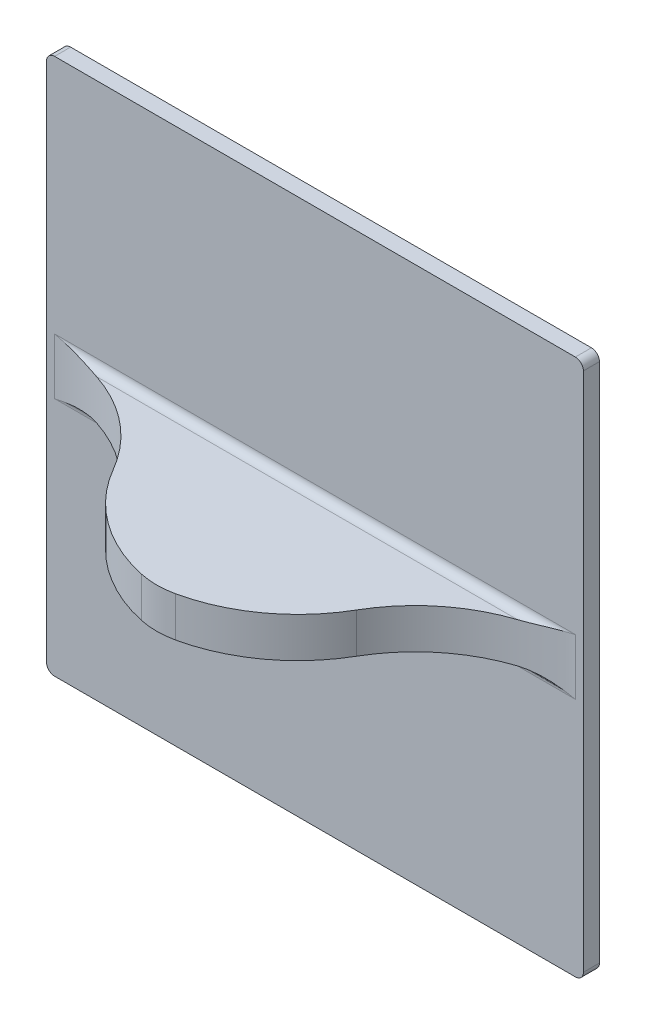
ISO-10303-21;
HEADER;
FILE_DESCRIPTION(('STEP AP214'),'2;1');
FILE_NAME('part.step','',(''),(''),'','','');
FILE_SCHEMA(('AUTOMOTIVE_DESIGN { 1 0 10303 214 1 1 1 1 }'));
ENDSEC;
DATA;
#1=APPLICATION_CONTEXT('core data for automotive mechanical design processes');
#2=APPLICATION_PROTOCOL_DEFINITION('international standard','automotive_design',2000,#1);
#3=PRODUCT_CONTEXT('',#1,'mechanical');
#4=PRODUCT('Part','Part','',(#3));
#5=PRODUCT_RELATED_PRODUCT_CATEGORY('part','',(#4));
#6=PRODUCT_DEFINITION_FORMATION('','',#4);
#7=PRODUCT_DEFINITION_CONTEXT('part definition',#1,'design');
#8=PRODUCT_DEFINITION('design','',#6,#7);
#9=PRODUCT_DEFINITION_SHAPE('','',#8);
#10=(LENGTH_UNIT() NAMED_UNIT(*) SI_UNIT(.MILLI.,.METRE.));
#11=(NAMED_UNIT(*) PLANE_ANGLE_UNIT() SI_UNIT($,.RADIAN.));
#12=(NAMED_UNIT(*) SI_UNIT($,.STERADIAN.) SOLID_ANGLE_UNIT());
#13=UNCERTAINTY_MEASURE_WITH_UNIT(LENGTH_MEASURE(1.E-05),#10,'distance_accuracy_value','');
#14=(GEOMETRIC_REPRESENTATION_CONTEXT(3) GLOBAL_UNCERTAINTY_ASSIGNED_CONTEXT((#13)) GLOBAL_UNIT_ASSIGNED_CONTEXT((#10,
#11,#12)) REPRESENTATION_CONTEXT('',''));
#15=CARTESIAN_POINT('',(0.,0.,0.));
#16=DIRECTION('',(0.,0.,1.));
#17=DIRECTION('',(1.,0.,0.));
#18=AXIS2_PLACEMENT_3D('',#15,#16,#17);
#19=CARTESIAN_POINT('',(-32.5,-32.5,2.));
#20=DIRECTION('',(0.,0.,1.));
#21=DIRECTION('',(1.,0.,0.));
#22=AXIS2_PLACEMENT_3D('',#19,#20,#21);
#23=PLANE('',#22);
#24=CARTESIAN_POINT('',(-32.5,-32.5,2.));
#25=DIRECTION('',(0.,0.,1.));
#26=DIRECTION('',(1.,0.,0.));
#27=AXIS2_PLACEMENT_3D('',#24,#25,#26);
#28=CIRCLE('',#27,1.);
#29=CARTESIAN_POINT('',(-33.5,-32.5,2.));
#30=VERTEX_POINT('',#29);
#31=CARTESIAN_POINT('',(-32.5,-33.5,2.));
#32=VERTEX_POINT('',#31);
#33=EDGE_CURVE('E156',#30,#32,#28,.T.);
#34=ORIENTED_EDGE('',*,*,#33,.T.);
#35=DIRECTION('',(1.,0.,0.));
#36=VECTOR('',#35,1.);
#37=CARTESIAN_POINT('',(-32.5,-33.5,2.));
#38=LINE('',#37,#36);
#39=CARTESIAN_POINT('',(32.5,-33.5,2.));
#40=VERTEX_POINT('',#39);
#41=EDGE_CURVE('E145',#32,#40,#38,.T.);
#42=ORIENTED_EDGE('',*,*,#41,.T.);
#43=CARTESIAN_POINT('',(32.5,-32.5,2.));
#44=DIRECTION('',(0.,0.,1.));
#45=DIRECTION('',(1.,0.,0.));
#46=AXIS2_PLACEMENT_3D('',#43,#44,#45);
#47=CIRCLE('',#46,1.);
#48=CARTESIAN_POINT('',(33.5,-32.5,2.));
#49=VERTEX_POINT('',#48);
#50=EDGE_CURVE('E155',#40,#49,#47,.T.);
#51=ORIENTED_EDGE('',*,*,#50,.T.);
#52=DIRECTION('',(0.,1.,0.));
#53=VECTOR('',#52,1.);
#54=CARTESIAN_POINT('',(33.5,-32.5,2.));
#55=LINE('',#54,#53);
#56=CARTESIAN_POINT('',(33.5,32.5,2.));
#57=VERTEX_POINT('',#56);
#58=EDGE_CURVE('E457',#49,#57,#55,.T.);
#59=ORIENTED_EDGE('',*,*,#58,.T.);
#60=CARTESIAN_POINT('',(32.5,32.5,2.));
#61=DIRECTION('',(0.,0.,1.));
#62=DIRECTION('',(1.,0.,0.));
#63=AXIS2_PLACEMENT_3D('',#60,#61,#62);
#64=CIRCLE('',#63,1.);
#65=CARTESIAN_POINT('',(32.5,33.5,2.));
#66=VERTEX_POINT('',#65);
#67=EDGE_CURVE('E484',#57,#66,#64,.T.);
#68=ORIENTED_EDGE('',*,*,#67,.T.);
#69=DIRECTION('',(-1.,0.,0.));
#70=VECTOR('',#69,1.);
#71=CARTESIAN_POINT('',(-32.5,33.5,2.));
#72=LINE('',#71,#70);
#73=CARTESIAN_POINT('',(-32.5,33.5,2.));
#74=VERTEX_POINT('',#73);
#75=EDGE_CURVE('E486',#66,#74,#72,.T.);
#76=ORIENTED_EDGE('',*,*,#75,.T.);
#77=CARTESIAN_POINT('',(-32.5,32.5,2.));
#78=DIRECTION('',(0.,0.,1.));
#79=DIRECTION('',(-1.,0.,0.));
#80=AXIS2_PLACEMENT_3D('',#77,#78,#79);
#81=CIRCLE('',#80,1.);
#82=CARTESIAN_POINT('',(-33.5,32.5,2.));
#83=VERTEX_POINT('',#82);
#84=EDGE_CURVE('E488',#74,#83,#81,.T.);
#85=ORIENTED_EDGE('',*,*,#84,.T.);
#86=DIRECTION('',(0.,-1.,0.));
#87=VECTOR('',#86,1.);
#88=CARTESIAN_POINT('',(-33.5,-32.5,2.));
#89=LINE('',#88,#87);
#90=EDGE_CURVE('E161',#83,#30,#89,.T.);
#91=ORIENTED_EDGE('',*,*,#90,.T.);
#92=EDGE_LOOP('',(#34,#42,#51,#59,#68,#76,#85,#91));
#93=FACE_BOUND('',#92,.T.);
#94=DIRECTION('',(0.,1.,0.));
#95=VECTOR('',#94,1.);
#96=CARTESIAN_POINT('',(32.5,-32.5,2.));
#97=LINE('',#96,#95);
#98=CARTESIAN_POINT('',(32.5,3.5,2.));
#99=VERTEX_POINT('',#98);
#100=CARTESIAN_POINT('',(32.5,-3.5,2.));
#101=VERTEX_POINT('',#100);
#102=EDGE_CURVE('E170',#99,#101,#97,.F.);
#103=ORIENTED_EDGE('',*,*,#102,.T.);
#104=DIRECTION('',(1.,0.,0.));
#105=VECTOR('',#104,1.);
#106=CARTESIAN_POINT('',(-32.5,-3.5,2.));
#107=LINE('',#106,#105);
#108=CARTESIAN_POINT('',(-32.5,-3.5,2.));
#109=VERTEX_POINT('',#108);
#110=EDGE_CURVE('E195',#101,#109,#107,.F.);
#111=ORIENTED_EDGE('',*,*,#110,.T.);
#112=DIRECTION('',(0.,-1.,0.));
#113=VECTOR('',#112,1.);
#114=CARTESIAN_POINT('',(-32.5,-32.5,2.));
#115=LINE('',#114,#113);
#116=CARTESIAN_POINT('',(-32.5,3.5,2.));
#117=VERTEX_POINT('',#116);
#118=EDGE_CURVE('E172',#109,#117,#115,.F.);
#119=ORIENTED_EDGE('',*,*,#118,.T.);
#120=DIRECTION('',(-1.,0.,0.));
#121=VECTOR('',#120,1.);
#122=CARTESIAN_POINT('',(-32.5,3.5,2.));
#123=LINE('',#122,#121);
#124=EDGE_CURVE('E192',#117,#99,#123,.F.);
#125=ORIENTED_EDGE('',*,*,#124,.T.);
#126=EDGE_LOOP('',(#103,#111,#119,#125));
#127=FACE_BOUND('',#126,.T.);
#128=ADVANCED_FACE('F33',(#93,#127),#23,.T.);
#129=CARTESIAN_POINT('',(-32.5,-32.5,2.));
#130=DIRECTION('',(0.,0.,-1.));
#131=DIRECTION('',(-1.,0.,0.));
#132=AXIS2_PLACEMENT_3D('',#129,#130,#131);
#133=CYLINDRICAL_SURFACE('',#132,1.);
#134=CARTESIAN_POINT('',(-32.5,-32.5,0.));
#135=DIRECTION('',(0.,0.,1.));
#136=DIRECTION('',(1.,0.,0.));
#137=AXIS2_PLACEMENT_3D('',#134,#135,#136);
#138=CIRCLE('',#137,1.);
#139=CARTESIAN_POINT('',(-33.5,-32.5,0.));
#140=VERTEX_POINT('',#139);
#141=CARTESIAN_POINT('',(-32.5,-33.5,0.));
#142=VERTEX_POINT('',#141);
#143=EDGE_CURVE('E169',#140,#142,#138,.T.);
#144=ORIENTED_EDGE('',*,*,#143,.T.);
#145=DIRECTION('',(0.,0.,-1.));
#146=VECTOR('',#145,1.);
#147=CARTESIAN_POINT('',(-32.5,-33.5,2.));
#148=LINE('',#147,#146);
#149=EDGE_CURVE('E149',#32,#142,#148,.T.);
#150=ORIENTED_EDGE('',*,*,#149,.F.);
#151=ORIENTED_EDGE('',*,*,#33,.F.);
#152=DIRECTION('',(0.,0.,-1.));
#153=VECTOR('',#152,1.);
#154=CARTESIAN_POINT('',(-33.5,-32.5,2.));
#155=LINE('',#154,#153);
#156=EDGE_CURVE('E471',#30,#140,#155,.T.);
#157=ORIENTED_EDGE('',*,*,#156,.T.);
#158=EDGE_LOOP('',(#144,#150,#151,#157));
#159=FACE_BOUND('',#158,.T.);
#160=ADVANCED_FACE('F167',(#159),#133,.T.);
#161=CARTESIAN_POINT('',(-32.5,-33.5,2.));
#162=DIRECTION('',(0.,1.,0.));
#163=DIRECTION('',(0.,0.,1.));
#164=AXIS2_PLACEMENT_3D('',#161,#162,#163);
#165=PLANE('',#164);
#166=DIRECTION('',(1.,0.,0.));
#167=VECTOR('',#166,1.);
#168=CARTESIAN_POINT('',(-32.5,-33.5,0.));
#169=LINE('',#168,#167);
#170=CARTESIAN_POINT('',(32.5,-33.5,0.));
#171=VERTEX_POINT('',#170);
#172=EDGE_CURVE('E453',#142,#171,#169,.T.);
#173=ORIENTED_EDGE('',*,*,#172,.T.);
#174=DIRECTION('',(0.,0.,-1.));
#175=VECTOR('',#174,1.);
#176=CARTESIAN_POINT('',(32.5,-33.5,2.));
#177=LINE('',#176,#175);
#178=EDGE_CURVE('E152',#40,#171,#177,.T.);
#179=ORIENTED_EDGE('',*,*,#178,.F.);
#180=ORIENTED_EDGE('',*,*,#41,.F.);
#181=ORIENTED_EDGE('',*,*,#149,.T.);
#182=EDGE_LOOP('',(#173,#179,#180,#181));
#183=FACE_BOUND('',#182,.T.);
#184=ADVANCED_FACE('F147',(#183),#165,.F.);
#185=CARTESIAN_POINT('',(32.5,-32.5,2.));
#186=DIRECTION('',(0.,0.,-1.));
#187=DIRECTION('',(-1.,0.,0.));
#188=AXIS2_PLACEMENT_3D('',#185,#186,#187);
#189=CYLINDRICAL_SURFACE('',#188,1.);
#190=CARTESIAN_POINT('',(32.5,-32.5,0.));
#191=DIRECTION('',(0.,0.,1.));
#192=DIRECTION('',(1.,0.,0.));
#193=AXIS2_PLACEMENT_3D('',#190,#191,#192);
#194=CIRCLE('',#193,1.);
#195=CARTESIAN_POINT('',(33.5,-32.5,0.));
#196=VERTEX_POINT('',#195);
#197=EDGE_CURVE('E448',#171,#196,#194,.T.);
#198=ORIENTED_EDGE('',*,*,#197,.T.);
#199=DIRECTION('',(0.,0.,-1.));
#200=VECTOR('',#199,1.);
#201=CARTESIAN_POINT('',(33.5,-32.5,2.));
#202=LINE('',#201,#200);
#203=EDGE_CURVE('E174',#49,#196,#202,.T.);
#204=ORIENTED_EDGE('',*,*,#203,.F.);
#205=ORIENTED_EDGE('',*,*,#50,.F.);
#206=ORIENTED_EDGE('',*,*,#178,.T.);
#207=EDGE_LOOP('',(#198,#204,#205,#206));
#208=FACE_BOUND('',#207,.T.);
#209=ADVANCED_FACE('F318',(#208),#189,.T.);
#210=CARTESIAN_POINT('',(33.5,-32.5,2.));
#211=DIRECTION('',(-1.,0.,0.));
#212=DIRECTION('',(0.,0.,1.));
#213=AXIS2_PLACEMENT_3D('',#210,#211,#212);
#214=PLANE('',#213);
#215=DIRECTION('',(0.,1.,0.));
#216=VECTOR('',#215,1.);
#217=CARTESIAN_POINT('',(33.5,-32.5,0.));
#218=LINE('',#217,#216);
#219=CARTESIAN_POINT('',(33.5,32.5,0.));
#220=VERTEX_POINT('',#219);
#221=EDGE_CURVE('E452',#196,#220,#218,.T.);
#222=ORIENTED_EDGE('',*,*,#221,.T.);
#223=DIRECTION('',(0.,0.,-1.));
#224=VECTOR('',#223,1.);
#225=CARTESIAN_POINT('',(33.5,32.5,2.));
#226=LINE('',#225,#224);
#227=EDGE_CURVE('E458',#57,#220,#226,.T.);
#228=ORIENTED_EDGE('',*,*,#227,.F.);
#229=ORIENTED_EDGE('',*,*,#58,.F.);
#230=ORIENTED_EDGE('',*,*,#203,.T.);
#231=EDGE_LOOP('',(#222,#228,#229,#230));
#232=FACE_BOUND('',#231,.T.);
#233=ADVANCED_FACE('F314',(#232),#214,.F.);
#234=CARTESIAN_POINT('',(32.5,32.5,2.));
#235=DIRECTION('',(0.,0.,-1.));
#236=DIRECTION('',(-1.,0.,0.));
#237=AXIS2_PLACEMENT_3D('',#234,#235,#236);
#238=CYLINDRICAL_SURFACE('',#237,1.);
#239=CARTESIAN_POINT('',(32.5,32.5,0.));
#240=DIRECTION('',(0.,0.,1.));
#241=DIRECTION('',(1.,0.,0.));
#242=AXIS2_PLACEMENT_3D('',#239,#240,#241);
#243=CIRCLE('',#242,1.);
#244=CARTESIAN_POINT('',(32.5,33.5,0.));
#245=VERTEX_POINT('',#244);
#246=EDGE_CURVE('E461',#220,#245,#243,.T.);
#247=ORIENTED_EDGE('',*,*,#246,.T.);
#248=DIRECTION('',(0.,0.,-1.));
#249=VECTOR('',#248,1.);
#250=CARTESIAN_POINT('',(32.5,33.5,2.));
#251=LINE('',#250,#249);
#252=EDGE_CURVE('E479',#66,#245,#251,.T.);
#253=ORIENTED_EDGE('',*,*,#252,.F.);
#254=ORIENTED_EDGE('',*,*,#67,.F.);
#255=ORIENTED_EDGE('',*,*,#227,.T.);
#256=EDGE_LOOP('',(#247,#253,#254,#255));
#257=FACE_BOUND('',#256,.T.);
#258=ADVANCED_FACE('F310',(#257),#238,.T.);
#259=CARTESIAN_POINT('',(-32.5,33.5,2.));
#260=DIRECTION('',(0.,-1.,0.));
#261=DIRECTION('',(0.,0.,-1.));
#262=AXIS2_PLACEMENT_3D('',#259,#260,#261);
#263=PLANE('',#262);
#264=DIRECTION('',(-1.,0.,0.));
#265=VECTOR('',#264,1.);
#266=CARTESIAN_POINT('',(-32.5,33.5,0.));
#267=LINE('',#266,#265);
#268=CARTESIAN_POINT('',(-32.5,33.5,0.));
#269=VERTEX_POINT('',#268);
#270=EDGE_CURVE('E463',#245,#269,#267,.T.);
#271=ORIENTED_EDGE('',*,*,#270,.T.);
#272=DIRECTION('',(0.,0.,-1.));
#273=VECTOR('',#272,1.);
#274=CARTESIAN_POINT('',(-32.5,33.5,2.));
#275=LINE('',#274,#273);
#276=EDGE_CURVE('E476',#74,#269,#275,.T.);
#277=ORIENTED_EDGE('',*,*,#276,.F.);
#278=ORIENTED_EDGE('',*,*,#75,.F.);
#279=ORIENTED_EDGE('',*,*,#252,.T.);
#280=EDGE_LOOP('',(#271,#277,#278,#279));
#281=FACE_BOUND('',#280,.T.);
#282=ADVANCED_FACE('F306',(#281),#263,.F.);
#283=CARTESIAN_POINT('',(-32.5,32.5,2.));
#284=DIRECTION('',(0.,0.,-1.));
#285=DIRECTION('',(-1.,0.,0.));
#286=AXIS2_PLACEMENT_3D('',#283,#284,#285);
#287=CYLINDRICAL_SURFACE('',#286,1.);
#288=CARTESIAN_POINT('',(-32.5,32.5,0.));
#289=DIRECTION('',(0.,0.,1.));
#290=DIRECTION('',(-1.,0.,0.));
#291=AXIS2_PLACEMENT_3D('',#288,#289,#290);
#292=CIRCLE('',#291,1.);
#293=CARTESIAN_POINT('',(-33.5,32.5,0.));
#294=VERTEX_POINT('',#293);
#295=EDGE_CURVE('E468',#269,#294,#292,.T.);
#296=ORIENTED_EDGE('',*,*,#295,.T.);
#297=DIRECTION('',(0.,0.,-1.));
#298=VECTOR('',#297,1.);
#299=CARTESIAN_POINT('',(-33.5,32.5,2.));
#300=LINE('',#299,#298);
#301=EDGE_CURVE('E473',#83,#294,#300,.T.);
#302=ORIENTED_EDGE('',*,*,#301,.F.);
#303=ORIENTED_EDGE('',*,*,#84,.F.);
#304=ORIENTED_EDGE('',*,*,#276,.T.);
#305=EDGE_LOOP('',(#296,#302,#303,#304));
#306=FACE_BOUND('',#305,.T.);
#307=ADVANCED_FACE('F302',(#306),#287,.T.);
#308=CARTESIAN_POINT('',(-33.5,-32.5,2.));
#309=DIRECTION('',(1.,0.,0.));
#310=DIRECTION('',(0.,0.,-1.));
#311=AXIS2_PLACEMENT_3D('',#308,#309,#310);
#312=PLANE('',#311);
#313=DIRECTION('',(0.,-1.,0.));
#314=VECTOR('',#313,1.);
#315=CARTESIAN_POINT('',(-33.5,-32.5,0.));
#316=LINE('',#315,#314);
#317=EDGE_CURVE('E165',#294,#140,#316,.T.);
#318=ORIENTED_EDGE('',*,*,#317,.T.);
#319=ORIENTED_EDGE('',*,*,#156,.F.);
#320=ORIENTED_EDGE('',*,*,#90,.F.);
#321=ORIENTED_EDGE('',*,*,#301,.T.);
#322=EDGE_LOOP('',(#318,#319,#320,#321));
#323=FACE_BOUND('',#322,.T.);
#324=ADVANCED_FACE('F298',(#323),#312,.F.);
#325=CARTESIAN_POINT('',(-32.5,-32.5,0.));
#326=DIRECTION('',(0.,0.,1.));
#327=DIRECTION('',(1.,0.,0.));
#328=AXIS2_PLACEMENT_3D('',#325,#326,#327);
#329=PLANE('',#328);
#330=ORIENTED_EDGE('',*,*,#143,.F.);
#331=ORIENTED_EDGE('',*,*,#317,.F.);
#332=ORIENTED_EDGE('',*,*,#295,.F.);
#333=ORIENTED_EDGE('',*,*,#270,.F.);
#334=ORIENTED_EDGE('',*,*,#246,.F.);
#335=ORIENTED_EDGE('',*,*,#221,.F.);
#336=ORIENTED_EDGE('',*,*,#197,.F.);
#337=ORIENTED_EDGE('',*,*,#172,.F.);
#338=EDGE_LOOP('',(#330,#331,#332,#333,#334,#335,#336,#337));
#339=FACE_BOUND('',#338,.T.);
#340=ADVANCED_FACE('F295',(#339),#329,.F.);
#341=CARTESIAN_POINT('',(-12.5,2.5,22.));
#342=DIRECTION('',(0.,-1.,0.));
#343=DIRECTION('',(0.,0.,-1.));
#344=AXIS2_PLACEMENT_3D('',#341,#342,#343);
#345=PLANE('',#344);
#346=CARTESIAN_POINT('',(2.14101615137754,2.5,2.));
#347=DIRECTION('',(0.,-1.,0.));
#348=DIRECTION('',(0.,0.,-1.));
#349=AXIS2_PLACEMENT_3D('',#346,#347,#348);
#350=CIRCLE('',#349,20.);
#351=CARTESIAN_POINT('',(-15.1794919243112,2.5,12.));
#352=VERTEX_POINT('',#351);
#353=CARTESIAN_POINT('',(-2.14101615137754,2.5,21.5362278692219));
#354=VERTEX_POINT('',#353);
#355=EDGE_CURVE('E255',#352,#354,#350,.F.);
#356=ORIENTED_EDGE('',*,*,#355,.T.);
#357=CARTESIAN_POINT('',(0.,2.5,11.7681139346109));
#358=DIRECTION('',(0.,-1.,0.));
#359=DIRECTION('',(0.,0.,-1.));
#360=AXIS2_PLACEMENT_3D('',#357,#358,#359);
#361=CIRCLE('',#360,10.);
#362=CARTESIAN_POINT('',(2.14101615137754,2.5,21.5362278692219));
#363=VERTEX_POINT('',#362);
#364=EDGE_CURVE('E55',#354,#363,#361,.F.);
#365=ORIENTED_EDGE('',*,*,#364,.T.);
#366=CARTESIAN_POINT('',(-2.14101615137754,2.5,2.));
#367=DIRECTION('',(0.,-1.,0.));
#368=DIRECTION('',(0.,0.,-1.));
#369=AXIS2_PLACEMENT_3D('',#366,#367,#368);
#370=CIRCLE('',#369,20.);
#371=CARTESIAN_POINT('',(15.1794919243112,2.5,12.));
#372=VERTEX_POINT('',#371);
#373=EDGE_CURVE('E253',#363,#372,#370,.F.);
#374=ORIENTED_EDGE('',*,*,#373,.T.);
#375=CARTESIAN_POINT('',(32.5,2.5,22.));
#376=DIRECTION('',(0.,-1.,0.));
#377=DIRECTION('',(0.,0.,-1.));
#378=AXIS2_PLACEMENT_3D('',#375,#376,#377);
#379=CIRCLE('',#378,20.);
#380=CARTESIAN_POINT('',(26.2550020016016,2.5,3.));
#381=VERTEX_POINT('',#380);
#382=EDGE_CURVE('E184',#372,#381,#379,.T.);
#383=ORIENTED_EDGE('',*,*,#382,.T.);
#384=DIRECTION('',(-1.,0.,0.));
#385=VECTOR('',#384,1.);
#386=CARTESIAN_POINT('',(-12.5,2.5,3.));
#387=LINE('',#386,#385);
#388=CARTESIAN_POINT('',(-26.2550020016016,2.5,3.));
#389=VERTEX_POINT('',#388);
#390=EDGE_CURVE('E198',#381,#389,#387,.T.);
#391=ORIENTED_EDGE('',*,*,#390,.T.);
#392=CARTESIAN_POINT('',(-32.5,2.5,22.));
#393=DIRECTION('',(0.,-1.,0.));
#394=DIRECTION('',(0.,0.,-1.));
#395=AXIS2_PLACEMENT_3D('',#392,#393,#394);
#396=CIRCLE('',#395,20.);
#397=EDGE_CURVE('E181',#389,#352,#396,.T.);
#398=ORIENTED_EDGE('',*,*,#397,.T.);
#399=EDGE_LOOP('',(#356,#365,#374,#383,#391,#398));
#400=FACE_BOUND('',#399,.T.);
#401=ADVANCED_FACE('F268',(#400),#345,.F.);
#402=CARTESIAN_POINT('',(-12.5,-2.5,22.));
#403=DIRECTION('',(0.,1.,0.));
#404=DIRECTION('',(0.,0.,1.));
#405=AXIS2_PLACEMENT_3D('',#402,#403,#404);
#406=PLANE('',#405);
#407=CARTESIAN_POINT('',(-2.14101615137754,-2.5,2.));
#408=DIRECTION('',(0.,1.,0.));
#409=DIRECTION('',(0.,0.,1.));
#410=AXIS2_PLACEMENT_3D('',#407,#408,#409);
#411=CIRCLE('',#410,20.);
#412=CARTESIAN_POINT('',(15.1794919243112,-2.5,12.));
#413=VERTEX_POINT('',#412);
#414=CARTESIAN_POINT('',(2.14101615137754,-2.5,21.5362278692219));
#415=VERTEX_POINT('',#414);
#416=EDGE_CURVE('E246',#413,#415,#411,.F.);
#417=ORIENTED_EDGE('',*,*,#416,.T.);
#418=CARTESIAN_POINT('',(0.,-2.5,11.7681139346109));
#419=DIRECTION('',(0.,1.,0.));
#420=DIRECTION('',(0.,0.,1.));
#421=AXIS2_PLACEMENT_3D('',#418,#419,#420);
#422=CIRCLE('',#421,10.);
#423=CARTESIAN_POINT('',(-2.14101615137754,-2.5,21.5362278692219));
#424=VERTEX_POINT('',#423);
#425=EDGE_CURVE('E11',#415,#424,#422,.F.);
#426=ORIENTED_EDGE('',*,*,#425,.T.);
#427=CARTESIAN_POINT('',(2.14101615137754,-2.5,2.));
#428=DIRECTION('',(0.,1.,0.));
#429=DIRECTION('',(0.,0.,1.));
#430=AXIS2_PLACEMENT_3D('',#427,#428,#429);
#431=CIRCLE('',#430,20.);
#432=CARTESIAN_POINT('',(-15.1794919243112,-2.5,12.));
#433=VERTEX_POINT('',#432);
#434=EDGE_CURVE('E248',#424,#433,#431,.F.);
#435=ORIENTED_EDGE('',*,*,#434,.T.);
#436=CARTESIAN_POINT('',(-32.5,-2.5,22.));
#437=DIRECTION('',(0.,1.,0.));
#438=DIRECTION('',(0.,0.,1.));
#439=AXIS2_PLACEMENT_3D('',#436,#437,#438);
#440=CIRCLE('',#439,20.);
#441=CARTESIAN_POINT('',(-26.2550020016016,-2.5,3.));
#442=VERTEX_POINT('',#441);
#443=EDGE_CURVE('E179',#433,#442,#440,.T.);
#444=ORIENTED_EDGE('',*,*,#443,.T.);
#445=DIRECTION('',(1.,0.,0.));
#446=VECTOR('',#445,1.);
#447=CARTESIAN_POINT('',(-12.5,-2.5,3.));
#448=LINE('',#447,#446);
#449=CARTESIAN_POINT('',(26.2550020016016,-2.5,3.));
#450=VERTEX_POINT('',#449);
#451=EDGE_CURVE('E189',#442,#450,#448,.T.);
#452=ORIENTED_EDGE('',*,*,#451,.T.);
#453=CARTESIAN_POINT('',(32.5,-2.5,22.));
#454=DIRECTION('',(0.,1.,0.));
#455=DIRECTION('',(0.,0.,1.));
#456=AXIS2_PLACEMENT_3D('',#453,#454,#455);
#457=CIRCLE('',#456,20.);
#458=EDGE_CURVE('E186',#450,#413,#457,.T.);
#459=ORIENTED_EDGE('',*,*,#458,.T.);
#460=EDGE_LOOP('',(#417,#426,#435,#444,#452,#459));
#461=FACE_BOUND('',#460,.T.);
#462=ADVANCED_FACE('F280',(#461),#406,.F.);
#463=CARTESIAN_POINT('',(-32.5,-2.5,22.));
#464=DIRECTION('',(0.,-1.,0.));
#465=DIRECTION('',(0.,0.,-1.));
#466=AXIS2_PLACEMENT_3D('',#463,#464,#465);
#467=CYLINDRICAL_SURFACE('',#466,20.);
#468=ORIENTED_EDGE('',*,*,#443,.F.);
#469=DIRECTION('',(0.,-1.,0.));
#470=VECTOR('',#469,1.);
#471=CARTESIAN_POINT('',(-15.1794919243112,-2.5,12.));
#472=LINE('',#471,#470);
#473=EDGE_CURVE('E250',#433,#352,#472,.F.);
#474=ORIENTED_EDGE('',*,*,#473,.T.);
#475=ORIENTED_EDGE('',*,*,#397,.F.);
#476=CARTESIAN_POINT('',(-26.2550020016016,2.5,3.));
#477=CARTESIAN_POINT('',(-26.3346748752038,2.50000492323291,2.97381255932595));
#478=CARTESIAN_POINT('',(-26.4145058655703,2.50102809560798,2.94812891598697));
#479=CARTESIAN_POINT('',(-26.5744356430935,2.50491656037852,2.8977825230451));
#480=CARTESIAN_POINT('',(-26.6545344002567,2.50778165290643,2.8731196629856));
#481=CARTESIAN_POINT('',(-26.8950819581273,2.51884390169426,2.80070506305208));
#482=CARTESIAN_POINT('',(-27.055885144673,2.529508539093,2.75449342351351));
#483=CARTESIAN_POINT('',(-27.3779815655355,2.55620438327657,2.66627865095913));
#484=CARTESIAN_POINT('',(-27.5392740263356,2.57222942134275,2.62427075216641));
#485=CARTESIAN_POINT('',(-27.8624081111726,2.60873561632444,2.54439790038469));
#486=CARTESIAN_POINT('',(-28.0242498571277,2.62921783621988,2.50653393891386));
#487=CARTESIAN_POINT('',(-28.5412095318135,2.70042903607685,2.39234723161959));
#488=CARTESIAN_POINT('',(-28.8971392463662,2.75814652137401,2.32387843528968));
#489=CARTESIAN_POINT('',(-29.6101235129158,2.88521773519961,2.20658440970555));
#490=CARTESIAN_POINT('',(-29.9671784565369,2.95457609021345,2.15776701692031));
#491=CARTESIAN_POINT('',(-31.0396527236031,3.17343643403151,2.04042645007476));
#492=CARTESIAN_POINT('',(-31.7564176047691,3.33372964886839,2.00100697450333));
#493=CARTESIAN_POINT('',(-32.481598379285,3.49588530413742,2.00000635185491));
#494=CARTESIAN_POINT('',(-32.4907992572089,3.49794268364357,2.00000000290788));
#495=CARTESIAN_POINT('',(-32.5,3.5,2.));
#496=B_SPLINE_CURVE_WITH_KNOTS('',3,(#476,#477,#478,#479,#480,#481,#482,#483,#484,#485,#486,
#487,#488,#489,#490,#491,#492,#493,#494,#495),.UNSPECIFIED.,.F.,.F.,(4,2,2,2,2,2,2,2,2,4),(0.,
0.251579466840737,0.503131639290544,1.0059107569527,1.508113258491,2.01043566031304,
3.11052898446617,4.21106056370139,6.41201196552983,6.44029624320449),.UNSPECIFIED.);
#497=EDGE_CURVE('E233',#389,#117,#496,.T.);
#498=ORIENTED_EDGE('',*,*,#497,.T.);
#499=ORIENTED_EDGE('',*,*,#118,.F.);
#500=CARTESIAN_POINT('',(-26.2550020016016,-2.5,3.));
#501=CARTESIAN_POINT('',(-26.3346748752038,-2.50000492323291,2.97381255932595));
#502=CARTESIAN_POINT('',(-26.4145058655703,-2.50102809560798,2.94812891598697));
#503=CARTESIAN_POINT('',(-26.5744356430935,-2.50491656037852,2.8977825230451));
#504=CARTESIAN_POINT('',(-26.6545344002567,-2.50778165290643,2.8731196629856));
#505=CARTESIAN_POINT('',(-26.8950819581273,-2.51884390169426,2.80070506305208));
#506=CARTESIAN_POINT('',(-27.055885144673,-2.529508539093,2.75449342351351));
#507=CARTESIAN_POINT('',(-27.3779815655355,-2.55620438327657,2.66627865095913));
#508=CARTESIAN_POINT('',(-27.5392740263356,-2.57222942134275,2.62427075216641));
#509=CARTESIAN_POINT('',(-27.8624081111726,-2.60873561632444,2.54439790038469));
#510=CARTESIAN_POINT('',(-28.0242498571277,-2.62921783621988,2.50653393891386));
#511=CARTESIAN_POINT('',(-28.5412095318135,-2.70042903607685,2.39234723161959));
#512=CARTESIAN_POINT('',(-28.8971392463662,-2.75814652137401,2.32387843528968));
#513=CARTESIAN_POINT('',(-29.6101235129158,-2.88521773519961,2.20658440970555));
#514=CARTESIAN_POINT('',(-29.9671784565369,-2.95457609021345,2.15776701692031));
#515=CARTESIAN_POINT('',(-31.0396527236031,-3.17343643403152,2.04042645007476));
#516=CARTESIAN_POINT('',(-31.7564176047691,-3.33372964886839,2.00100697450333));
#517=CARTESIAN_POINT('',(-32.481598379285,-3.49588530413742,2.00000635185491));
#518=CARTESIAN_POINT('',(-32.4907992572089,-3.49794268364357,2.00000000290788));
#519=CARTESIAN_POINT('',(-32.5,-3.5,2.));
#520=B_SPLINE_CURVE_WITH_KNOTS('',3,(#500,#501,#502,#503,#504,#505,#506,#507,#508,#509,#510,
#511,#512,#513,#514,#515,#516,#517,#518,#519),.UNSPECIFIED.,.F.,.F.,(4,2,2,2,2,2,2,2,2,4),(0.,
0.251579466840737,0.503131639290544,1.0059107569527,1.508113258491,2.01043566031304,
3.11052898446617,4.21106056370139,6.41201196552983,6.44029624320449),.UNSPECIFIED.);
#521=EDGE_CURVE('E210',#109,#442,#520,.F.);
#522=ORIENTED_EDGE('',*,*,#521,.T.);
#523=EDGE_LOOP('',(#468,#474,#475,#498,#499,#522));
#524=FACE_BOUND('',#523,.T.);
#525=ADVANCED_FACE('F274',(#524),#467,.F.);
#526=CARTESIAN_POINT('',(32.5,-2.5,22.));
#527=DIRECTION('',(0.,1.,0.));
#528=DIRECTION('',(0.,0.,1.));
#529=AXIS2_PLACEMENT_3D('',#526,#527,#528);
#530=CYLINDRICAL_SURFACE('',#529,20.);
#531=ORIENTED_EDGE('',*,*,#382,.F.);
#532=DIRECTION('',(0.,1.,0.));
#533=VECTOR('',#532,1.);
#534=CARTESIAN_POINT('',(15.1794919243112,-2.5,12.));
#535=LINE('',#534,#533);
#536=EDGE_CURVE('E257',#372,#413,#535,.F.);
#537=ORIENTED_EDGE('',*,*,#536,.T.);
#538=ORIENTED_EDGE('',*,*,#458,.F.);
#539=CARTESIAN_POINT('',(26.2550020016016,-2.5,3.));
#540=CARTESIAN_POINT('',(26.3346748752038,-2.50000492323291,2.97381255932595));
#541=CARTESIAN_POINT('',(26.4145058655703,-2.50102809560798,2.94812891598697));
#542=CARTESIAN_POINT('',(26.5744356430935,-2.50491656037852,2.8977825230451));
#543=CARTESIAN_POINT('',(26.6545344002567,-2.50778165290643,2.8731196629856));
#544=CARTESIAN_POINT('',(26.8950819581273,-2.51884390169426,2.80070506305208));
#545=CARTESIAN_POINT('',(27.055885144673,-2.529508539093,2.75449342351351));
#546=CARTESIAN_POINT('',(27.3779815655355,-2.55620438327657,2.66627865095913));
#547=CARTESIAN_POINT('',(27.5392740263356,-2.57222942134275,2.62427075216641));
#548=CARTESIAN_POINT('',(27.8624081111726,-2.60873561632444,2.54439790038469));
#549=CARTESIAN_POINT('',(28.0242498571277,-2.62921783621988,2.50653393891386));
#550=CARTESIAN_POINT('',(28.5412095318135,-2.70042903607685,2.39234723161959));
#551=CARTESIAN_POINT('',(28.8971392463662,-2.75814652137401,2.32387843528968));
#552=CARTESIAN_POINT('',(29.6101235129158,-2.88521773519961,2.20658440970555));
#553=CARTESIAN_POINT('',(29.9671784565369,-2.95457609021345,2.15776701692031));
#554=CARTESIAN_POINT('',(31.0396527236031,-3.17343643403152,2.04042645007476));
#555=CARTESIAN_POINT('',(31.7564176047691,-3.33372964886839,2.00100697450333));
#556=CARTESIAN_POINT('',(32.481598379285,-3.49588530413742,2.00000635185491));
#557=CARTESIAN_POINT('',(32.4907992572089,-3.49794268364357,2.00000000290788));
#558=CARTESIAN_POINT('',(32.5,-3.5,2.));
#559=B_SPLINE_CURVE_WITH_KNOTS('',3,(#539,#540,#541,#542,#543,#544,#545,#546,#547,#548,#549,
#550,#551,#552,#553,#554,#555,#556,#557,#558),.UNSPECIFIED.,.F.,.F.,(4,2,2,2,2,2,2,2,2,4),(0.,
0.251579466840737,0.503131639290544,1.0059107569527,1.508113258491,2.01043566031304,
3.11052898446617,4.21106056370139,6.41201196552983,6.44029624320449),.UNSPECIFIED.);
#560=EDGE_CURVE('E201',#450,#101,#559,.T.);
#561=ORIENTED_EDGE('',*,*,#560,.T.);
#562=ORIENTED_EDGE('',*,*,#102,.F.);
#563=CARTESIAN_POINT('',(26.2550020016016,2.5,3.));
#564=CARTESIAN_POINT('',(26.3346748752038,2.50000492323291,2.97381255932595));
#565=CARTESIAN_POINT('',(26.4145058655703,2.50102809560798,2.94812891598697));
#566=CARTESIAN_POINT('',(26.5744356430935,2.50491656037852,2.8977825230451));
#567=CARTESIAN_POINT('',(26.6545344002567,2.50778165290643,2.8731196629856));
#568=CARTESIAN_POINT('',(26.8950819581273,2.51884390169426,2.80070506305208));
#569=CARTESIAN_POINT('',(27.055885144673,2.529508539093,2.75449342351351));
#570=CARTESIAN_POINT('',(27.3779815655355,2.55620438327657,2.66627865095913));
#571=CARTESIAN_POINT('',(27.5392740263356,2.57222942134275,2.62427075216641));
#572=CARTESIAN_POINT('',(27.8624081111726,2.60873561632444,2.54439790038469));
#573=CARTESIAN_POINT('',(28.0242498571277,2.62921783621988,2.50653393891386));
#574=CARTESIAN_POINT('',(28.5412095318135,2.70042903607685,2.39234723161959));
#575=CARTESIAN_POINT('',(28.8971392463662,2.75814652137401,2.32387843528968));
#576=CARTESIAN_POINT('',(29.6101235129158,2.88521773519961,2.20658440970555));
#577=CARTESIAN_POINT('',(29.9671784565369,2.95457609021345,2.15776701692031));
#578=CARTESIAN_POINT('',(31.0396527236031,3.17343643403151,2.04042645007476));
#579=CARTESIAN_POINT('',(31.7564176047691,3.33372964886839,2.00100697450333));
#580=CARTESIAN_POINT('',(32.481598379285,3.49588530413742,2.00000635185491));
#581=CARTESIAN_POINT('',(32.4907992572089,3.49794268364357,2.00000000290788));
#582=CARTESIAN_POINT('',(32.5,3.5,2.));
#583=B_SPLINE_CURVE_WITH_KNOTS('',3,(#563,#564,#565,#566,#567,#568,#569,#570,#571,#572,#573,
#574,#575,#576,#577,#578,#579,#580,#581,#582),.UNSPECIFIED.,.F.,.F.,(4,2,2,2,2,2,2,2,2,4),(0.,
0.251579466840737,0.503131639290544,1.0059107569527,1.508113258491,2.01043566031304,
3.11052898446617,4.21106056370139,6.41201196552983,6.44029624320449),.UNSPECIFIED.);
#584=EDGE_CURVE('E239',#99,#381,#583,.F.);
#585=ORIENTED_EDGE('',*,*,#584,.T.);
#586=EDGE_LOOP('',(#531,#537,#538,#561,#562,#585));
#587=FACE_BOUND('',#586,.T.);
#588=ADVANCED_FACE('F217',(#587),#530,.F.);
#589=CARTESIAN_POINT('',(-12.5,-3.5,3.));
#590=DIRECTION('',(1.,0.,0.));
#591=DIRECTION('',(0.,0.,-1.));
#592=AXIS2_PLACEMENT_3D('',#589,#590,#591);
#593=CYLINDRICAL_SURFACE('',#592,1.);
#594=ORIENTED_EDGE('',*,*,#521,.F.);
#595=ORIENTED_EDGE('',*,*,#110,.F.);
#596=ORIENTED_EDGE('',*,*,#560,.F.);
#597=ORIENTED_EDGE('',*,*,#451,.F.);
#598=EDGE_LOOP('',(#594,#595,#596,#597));
#599=FACE_BOUND('',#598,.T.);
#600=ADVANCED_FACE('F219',(#599),#593,.F.);
#601=CARTESIAN_POINT('',(-12.5,3.5,3.));
#602=DIRECTION('',(-1.,0.,0.));
#603=DIRECTION('',(0.,0.,1.));
#604=AXIS2_PLACEMENT_3D('',#601,#602,#603);
#605=CYLINDRICAL_SURFACE('',#604,1.);
#606=ORIENTED_EDGE('',*,*,#584,.F.);
#607=ORIENTED_EDGE('',*,*,#124,.F.);
#608=ORIENTED_EDGE('',*,*,#497,.F.);
#609=ORIENTED_EDGE('',*,*,#390,.F.);
#610=EDGE_LOOP('',(#606,#607,#608,#609));
#611=FACE_BOUND('',#610,.T.);
#612=ADVANCED_FACE('F223',(#611),#605,.F.);
#613=CARTESIAN_POINT('',(-2.14101615137754,-2.5,2.));
#614=DIRECTION('',(0.,1.,0.));
#615=DIRECTION('',(0.,0.,1.));
#616=AXIS2_PLACEMENT_3D('',#613,#614,#615);
#617=CYLINDRICAL_SURFACE('',#616,20.);
#618=ORIENTED_EDGE('',*,*,#373,.F.);
#619=DIRECTION('',(0.,1.,0.));
#620=VECTOR('',#619,1.);
#621=CARTESIAN_POINT('',(2.14101615137755,-2.5,21.5362278692219));
#622=LINE('',#621,#620);
#623=EDGE_CURVE('E41',#363,#415,#622,.F.);
#624=ORIENTED_EDGE('',*,*,#623,.T.);
#625=ORIENTED_EDGE('',*,*,#416,.F.);
#626=ORIENTED_EDGE('',*,*,#536,.F.);
#627=EDGE_LOOP('',(#618,#624,#625,#626));
#628=FACE_BOUND('',#627,.T.);
#629=ADVANCED_FACE('F229',(#628),#617,.T.);
#630=CARTESIAN_POINT('',(2.14101615137754,-2.5,2.));
#631=DIRECTION('',(0.,-1.,0.));
#632=DIRECTION('',(0.,0.,-1.));
#633=AXIS2_PLACEMENT_3D('',#630,#631,#632);
#634=CYLINDRICAL_SURFACE('',#633,20.);
#635=ORIENTED_EDGE('',*,*,#434,.F.);
#636=DIRECTION('',(0.,-1.,0.));
#637=VECTOR('',#636,1.);
#638=CARTESIAN_POINT('',(-2.14101615137755,-2.5,21.5362278692219));
#639=LINE('',#638,#637);
#640=EDGE_CURVE('E259',#424,#354,#639,.F.);
#641=ORIENTED_EDGE('',*,*,#640,.T.);
#642=ORIENTED_EDGE('',*,*,#355,.F.);
#643=ORIENTED_EDGE('',*,*,#473,.F.);
#644=EDGE_LOOP('',(#635,#641,#642,#643));
#645=FACE_BOUND('',#644,.T.);
#646=ADVANCED_FACE('F231',(#645),#634,.T.);
#647=CARTESIAN_POINT('',(0.,-2.5,11.7681139346109));
#648=DIRECTION('',(0.,1.,0.));
#649=DIRECTION('',(0.,0.,1.));
#650=AXIS2_PLACEMENT_3D('',#647,#648,#649);
#651=CYLINDRICAL_SURFACE('',#650,10.);
#652=ORIENTED_EDGE('',*,*,#425,.F.);
#653=ORIENTED_EDGE('',*,*,#623,.F.);
#654=ORIENTED_EDGE('',*,*,#364,.F.);
#655=ORIENTED_EDGE('',*,*,#640,.F.);
#656=EDGE_LOOP('',(#652,#653,#654,#655));
#657=FACE_BOUND('',#656,.T.);
#658=ADVANCED_FACE('F35',(#657),#651,.T.);
#659=CLOSED_SHELL('',(#128,#160,#184,#209,#233,#258,#282,#307,#324,#340,#401,#462,#525,#588,
#600,#612,#629,#646,#658));
#660=MANIFOLD_SOLID_BREP('B2',#659);
#661=ADVANCED_BREP_SHAPE_REPRESENTATION('',(#18,#660),#14);
#662=SHAPE_DEFINITION_REPRESENTATION(#9,#661);
ENDSEC;
END-ISO-10303-21;
